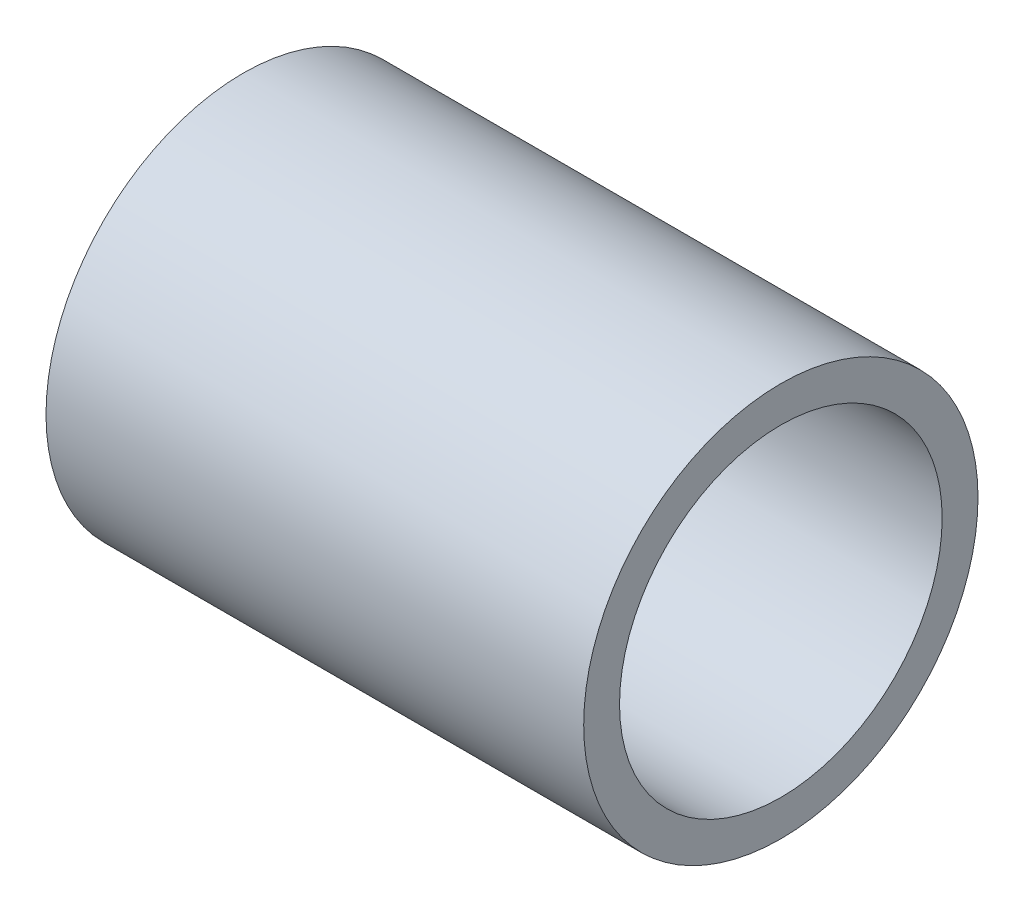
ISO-10303-21;
HEADER;
FILE_DESCRIPTION(('STEP AP214'),'2;1');
FILE_NAME('part.step','',(''),(''),'','','');
FILE_SCHEMA(('AUTOMOTIVE_DESIGN { 1 0 10303 214 1 1 1 1 }'));
ENDSEC;
DATA;
#1=APPLICATION_CONTEXT('core data for automotive mechanical design processes');
#2=APPLICATION_PROTOCOL_DEFINITION('international standard','automotive_design',2000,#1);
#3=PRODUCT_CONTEXT('',#1,'mechanical');
#4=PRODUCT('Part','Part','',(#3));
#5=PRODUCT_RELATED_PRODUCT_CATEGORY('part','',(#4));
#6=PRODUCT_DEFINITION_FORMATION('','',#4);
#7=PRODUCT_DEFINITION_CONTEXT('part definition',#1,'design');
#8=PRODUCT_DEFINITION('design','',#6,#7);
#9=PRODUCT_DEFINITION_SHAPE('','',#8);
#10=(LENGTH_UNIT() NAMED_UNIT(*) SI_UNIT(.MILLI.,.METRE.));
#11=(NAMED_UNIT(*) PLANE_ANGLE_UNIT() SI_UNIT($,.RADIAN.));
#12=(NAMED_UNIT(*) SI_UNIT($,.STERADIAN.) SOLID_ANGLE_UNIT());
#13=UNCERTAINTY_MEASURE_WITH_UNIT(LENGTH_MEASURE(1.E-05),#10,'distance_accuracy_value','');
#14=(GEOMETRIC_REPRESENTATION_CONTEXT(3) GLOBAL_UNCERTAINTY_ASSIGNED_CONTEXT((#13)) GLOBAL_UNIT_ASSIGNED_CONTEXT((#10,
#11,#12)) REPRESENTATION_CONTEXT('',''));
#15=CARTESIAN_POINT('',(0.,0.,0.));
#16=DIRECTION('',(0.,0.,1.));
#17=DIRECTION('',(1.,0.,0.));
#18=AXIS2_PLACEMENT_3D('',#15,#16,#17);
#19=CARTESIAN_POINT('',(30.,0.,0.));
#20=DIRECTION('',(1.,0.,0.));
#21=DIRECTION('',(0.,0.,-1.));
#22=AXIS2_PLACEMENT_3D('',#19,#20,#21);
#23=PLANE('',#22);
#24=CARTESIAN_POINT('',(30.,0.,0.));
#25=DIRECTION('',(1.,0.,0.));
#26=DIRECTION('',(0.,0.,-1.));
#27=AXIS2_PLACEMENT_3D('',#24,#25,#26);
#28=CIRCLE('',#27,11.);
#29=CARTESIAN_POINT('',(30.,0.,-11.));
#30=VERTEX_POINT('',#29);
#31=EDGE_CURVE('E10',#30,#30,#28,.T.);
#32=ORIENTED_EDGE('',*,*,#31,.T.);
#33=EDGE_LOOP('',(#32));
#34=FACE_BOUND('',#33,.T.);
#35=CARTESIAN_POINT('',(30.,0.,0.));
#36=DIRECTION('',(1.,0.,0.));
#37=DIRECTION('',(0.,0.,-1.));
#38=AXIS2_PLACEMENT_3D('',#35,#36,#37);
#39=CIRCLE('',#38,9.);
#40=CARTESIAN_POINT('',(30.,0.,-9.));
#41=VERTEX_POINT('',#40);
#42=EDGE_CURVE('E52',#41,#41,#39,.T.);
#43=ORIENTED_EDGE('',*,*,#42,.F.);
#44=EDGE_LOOP('',(#43));
#45=FACE_BOUND('',#44,.T.);
#46=ADVANCED_FACE('F41',(#34,#45),#23,.T.);
#47=CARTESIAN_POINT('',(0.,0.,0.));
#48=DIRECTION('',(1.,0.,0.));
#49=DIRECTION('',(0.,0.,-1.));
#50=AXIS2_PLACEMENT_3D('',#47,#48,#49);
#51=PLANE('',#50);
#52=CARTESIAN_POINT('',(0.,0.,0.));
#53=DIRECTION('',(1.,0.,0.));
#54=DIRECTION('',(0.,0.,-1.));
#55=AXIS2_PLACEMENT_3D('',#52,#53,#54);
#56=CIRCLE('',#55,11.);
#57=CARTESIAN_POINT('',(0.,0.,-11.));
#58=VERTEX_POINT('',#57);
#59=EDGE_CURVE('E45',#58,#58,#56,.T.);
#60=ORIENTED_EDGE('',*,*,#59,.F.);
#61=EDGE_LOOP('',(#60));
#62=FACE_BOUND('',#61,.T.);
#63=CARTESIAN_POINT('',(0.,0.,0.));
#64=DIRECTION('',(1.,0.,0.));
#65=DIRECTION('',(0.,0.,-1.));
#66=AXIS2_PLACEMENT_3D('',#63,#64,#65);
#67=CIRCLE('',#66,9.);
#68=CARTESIAN_POINT('',(0.,0.,-9.));
#69=VERTEX_POINT('',#68);
#70=EDGE_CURVE('E54',#69,#69,#67,.T.);
#71=ORIENTED_EDGE('',*,*,#70,.T.);
#72=EDGE_LOOP('',(#71));
#73=FACE_BOUND('',#72,.T.);
#74=ADVANCED_FACE('F64',(#62,#73),#51,.F.);
#75=CARTESIAN_POINT('',(30.,0.,0.));
#76=DIRECTION('',(-1.,0.,0.));
#77=DIRECTION('',(0.,0.,1.));
#78=AXIS2_PLACEMENT_3D('',#75,#76,#77);
#79=CYLINDRICAL_SURFACE('',#78,11.);
#80=ORIENTED_EDGE('',*,*,#31,.F.);
#81=EDGE_LOOP('',(#80));
#82=FACE_BOUND('',#81,.T.);
#83=ORIENTED_EDGE('',*,*,#59,.T.);
#84=EDGE_LOOP('',(#83));
#85=FACE_BOUND('',#84,.T.);
#86=ADVANCED_FACE('F43',(#82,#85),#79,.T.);
#87=CARTESIAN_POINT('',(30.,0.,0.));
#88=DIRECTION('',(-1.,0.,0.));
#89=DIRECTION('',(0.,0.,1.));
#90=AXIS2_PLACEMENT_3D('',#87,#88,#89);
#91=CYLINDRICAL_SURFACE('',#90,9.);
#92=ORIENTED_EDGE('',*,*,#42,.T.);
#93=EDGE_LOOP('',(#92));
#94=FACE_BOUND('',#93,.T.);
#95=ORIENTED_EDGE('',*,*,#70,.F.);
#96=EDGE_LOOP('',(#95));
#97=FACE_BOUND('',#96,.T.);
#98=ADVANCED_FACE('F60',(#94,#97),#91,.F.);
#99=CLOSED_SHELL('',(#46,#74,#86,#98));
#100=MANIFOLD_SOLID_BREP('B2',#99);
#101=ADVANCED_BREP_SHAPE_REPRESENTATION('',(#18,#100),#14);
#102=SHAPE_DEFINITION_REPRESENTATION(#9,#101);
ENDSEC;
END-ISO-10303-21;
